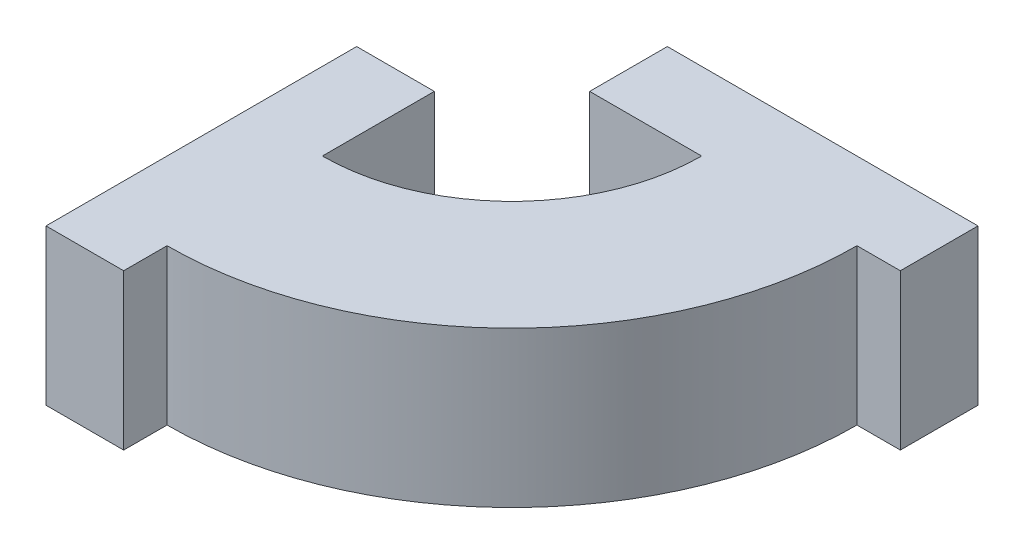
ISO-10303-21;
HEADER;
FILE_DESCRIPTION(('STEP AP214'),'2;1');
FILE_NAME('part.step','',(''),(''),'','','');
FILE_SCHEMA(('AUTOMOTIVE_DESIGN { 1 0 10303 214 1 1 1 1 }'));
ENDSEC;
DATA;
#1=APPLICATION_CONTEXT('core data for automotive mechanical design processes');
#2=APPLICATION_PROTOCOL_DEFINITION('international standard','automotive_design',2000,#1);
#3=PRODUCT_CONTEXT('',#1,'mechanical');
#4=PRODUCT('Part','Part','',(#3));
#5=PRODUCT_RELATED_PRODUCT_CATEGORY('part','',(#4));
#6=PRODUCT_DEFINITION_FORMATION('','',#4);
#7=PRODUCT_DEFINITION_CONTEXT('part definition',#1,'design');
#8=PRODUCT_DEFINITION('design','',#6,#7);
#9=PRODUCT_DEFINITION_SHAPE('','',#8);
#10=(LENGTH_UNIT() NAMED_UNIT(*) SI_UNIT(.MILLI.,.METRE.));
#11=(NAMED_UNIT(*) PLANE_ANGLE_UNIT() SI_UNIT($,.RADIAN.));
#12=(NAMED_UNIT(*) SI_UNIT($,.STERADIAN.) SOLID_ANGLE_UNIT());
#13=UNCERTAINTY_MEASURE_WITH_UNIT(LENGTH_MEASURE(1.E-05),#10,'distance_accuracy_value','');
#14=(GEOMETRIC_REPRESENTATION_CONTEXT(3) GLOBAL_UNCERTAINTY_ASSIGNED_CONTEXT((#13)) GLOBAL_UNIT_ASSIGNED_CONTEXT((#10,
#11,#12)) REPRESENTATION_CONTEXT('',''));
#15=CARTESIAN_POINT('',(0.,0.,0.));
#16=DIRECTION('',(0.,0.,1.));
#17=DIRECTION('',(1.,0.,0.));
#18=AXIS2_PLACEMENT_3D('',#15,#16,#17);
#19=CARTESIAN_POINT('',(1.,2.,0.));
#20=DIRECTION('',(1.,0.,0.));
#21=DIRECTION('',(0.,0.,-1.));
#22=AXIS2_PLACEMENT_3D('',#19,#20,#21);
#23=PLANE('',#22);
#24=DIRECTION('',(0.,0.,1.));
#25=VECTOR('',#24,1.);
#26=CARTESIAN_POINT('',(1.,0.,0.));
#27=LINE('',#26,#25);
#28=CARTESIAN_POINT('',(0.999999999999993,0.,2.));
#29=VERTEX_POINT('',#28);
#30=CARTESIAN_POINT('',(0.999999999999988,0.,3.44167053321325));
#31=VERTEX_POINT('',#30);
#32=EDGE_CURVE('E249',#29,#31,#27,.T.);
#33=ORIENTED_EDGE('',*,*,#32,.F.);
#34=DIRECTION('',(0.,-1.,0.));
#35=VECTOR('',#34,1.);
#36=CARTESIAN_POINT('',(0.999999999999993,2.,2.));
#37=LINE('',#36,#35);
#38=CARTESIAN_POINT('',(0.999999999999993,2.,2.));
#39=VERTEX_POINT('',#38);
#40=EDGE_CURVE('E11',#39,#29,#37,.T.);
#41=ORIENTED_EDGE('',*,*,#40,.F.);
#42=DIRECTION('',(0.,0.,1.));
#43=VECTOR('',#42,1.);
#44=CARTESIAN_POINT('',(1.,2.,0.));
#45=LINE('',#44,#43);
#46=CARTESIAN_POINT('',(0.999999999999988,2.,3.44167053321325));
#47=VERTEX_POINT('',#46);
#48=EDGE_CURVE('E181',#39,#47,#45,.T.);
#49=ORIENTED_EDGE('',*,*,#48,.T.);
#50=DIRECTION('',(0.,-1.,0.));
#51=VECTOR('',#50,1.);
#52=CARTESIAN_POINT('',(0.999999999999988,2.,3.44167053321325));
#53=LINE('',#52,#51);
#54=EDGE_CURVE('E59',#47,#31,#53,.T.);
#55=ORIENTED_EDGE('',*,*,#54,.T.);
#56=EDGE_LOOP('',(#33,#41,#49,#55));
#57=FACE_BOUND('',#56,.T.);
#58=ADVANCED_FACE('F41',(#57),#23,.T.);
#59=CARTESIAN_POINT('',(0.,2.,2.));
#60=DIRECTION('',(0.,0.,-1.));
#61=DIRECTION('',(-1.,0.,0.));
#62=AXIS2_PLACEMENT_3D('',#59,#60,#61);
#63=PLANE('',#62);
#64=DIRECTION('',(1.,0.,0.));
#65=VECTOR('',#64,1.);
#66=CARTESIAN_POINT('',(0.,0.,2.));
#67=LINE('',#66,#65);
#68=CARTESIAN_POINT('',(0.,0.,2.));
#69=VERTEX_POINT('',#68);
#70=EDGE_CURVE('E242',#69,#29,#67,.T.);
#71=ORIENTED_EDGE('',*,*,#70,.F.);
#72=DIRECTION('',(0.,-1.,0.));
#73=VECTOR('',#72,1.);
#74=CARTESIAN_POINT('',(0.,2.,2.));
#75=LINE('',#74,#73);
#76=CARTESIAN_POINT('',(0.,2.,2.));
#77=VERTEX_POINT('',#76);
#78=EDGE_CURVE('E51',#77,#69,#75,.T.);
#79=ORIENTED_EDGE('',*,*,#78,.F.);
#80=DIRECTION('',(1.,0.,0.));
#81=VECTOR('',#80,1.);
#82=CARTESIAN_POINT('',(0.,2.,2.));
#83=LINE('',#82,#81);
#84=EDGE_CURVE('E188',#77,#39,#83,.T.);
#85=ORIENTED_EDGE('',*,*,#84,.T.);
#86=ORIENTED_EDGE('',*,*,#40,.T.);
#87=EDGE_LOOP('',(#71,#79,#85,#86));
#88=FACE_BOUND('',#87,.T.);
#89=ADVANCED_FACE('F43',(#88),#63,.T.);
#90=CARTESIAN_POINT('',(0.,2.,0.));
#91=DIRECTION('',(1.,0.,0.));
#92=DIRECTION('',(0.,0.,-1.));
#93=AXIS2_PLACEMENT_3D('',#90,#91,#92);
#94=PLANE('',#93);
#95=DIRECTION('',(0.,0.,1.));
#96=VECTOR('',#95,1.);
#97=CARTESIAN_POINT('',(0.,0.,0.));
#98=LINE('',#97,#96);
#99=CARTESIAN_POINT('',(0.,0.,6.));
#100=VERTEX_POINT('',#99);
#101=EDGE_CURVE('E235',#69,#100,#98,.T.);
#102=ORIENTED_EDGE('',*,*,#101,.T.);
#103=DIRECTION('',(0.,-1.,0.));
#104=VECTOR('',#103,1.);
#105=CARTESIAN_POINT('',(0.,2.,6.));
#106=LINE('',#105,#104);
#107=CARTESIAN_POINT('',(0.,2.,6.));
#108=VERTEX_POINT('',#107);
#109=EDGE_CURVE('E226',#108,#100,#106,.T.);
#110=ORIENTED_EDGE('',*,*,#109,.F.);
#111=DIRECTION('',(0.,0.,1.));
#112=VECTOR('',#111,1.);
#113=CARTESIAN_POINT('',(0.,2.,0.));
#114=LINE('',#113,#112);
#115=EDGE_CURVE('E185',#77,#108,#114,.T.);
#116=ORIENTED_EDGE('',*,*,#115,.F.);
#117=ORIENTED_EDGE('',*,*,#78,.T.);
#118=EDGE_LOOP('',(#102,#110,#116,#117));
#119=FACE_BOUND('',#118,.T.);
#120=ADVANCED_FACE('F233',(#119),#94,.F.);
#121=CARTESIAN_POINT('',(0.,2.,6.));
#122=DIRECTION('',(0.,0.,-1.));
#123=DIRECTION('',(-1.,0.,0.));
#124=AXIS2_PLACEMENT_3D('',#121,#122,#123);
#125=PLANE('',#124);
#126=DIRECTION('',(1.,0.,0.));
#127=VECTOR('',#126,1.);
#128=CARTESIAN_POINT('',(0.,0.,6.));
#129=LINE('',#128,#127);
#130=CARTESIAN_POINT('',(0.999999999999979,0.,6.));
#131=VERTEX_POINT('',#130);
#132=EDGE_CURVE('E245',#100,#131,#129,.T.);
#133=ORIENTED_EDGE('',*,*,#132,.T.);
#134=DIRECTION('',(0.,-1.,0.));
#135=VECTOR('',#134,1.);
#136=CARTESIAN_POINT('',(0.999999999999979,2.,6.));
#137=LINE('',#136,#135);
#138=CARTESIAN_POINT('',(0.999999999999979,2.,6.));
#139=VERTEX_POINT('',#138);
#140=EDGE_CURVE('E223',#139,#131,#137,.T.);
#141=ORIENTED_EDGE('',*,*,#140,.F.);
#142=DIRECTION('',(1.,0.,0.));
#143=VECTOR('',#142,1.);
#144=CARTESIAN_POINT('',(0.,2.,6.));
#145=LINE('',#144,#143);
#146=EDGE_CURVE('E179',#108,#139,#145,.T.);
#147=ORIENTED_EDGE('',*,*,#146,.F.);
#148=ORIENTED_EDGE('',*,*,#109,.T.);
#149=EDGE_LOOP('',(#133,#141,#147,#148));
#150=FACE_BOUND('',#149,.T.);
#151=ADVANCED_FACE('F287',(#150),#125,.F.);
#152=CARTESIAN_POINT('',(0.999999999999981,0.,5.44167053321325));
#153=VERTEX_POINT('',#152);
#154=EDGE_CURVE('E253',#153,#131,#27,.T.);
#155=ORIENTED_EDGE('',*,*,#154,.F.);
#156=DIRECTION('',(0.,-1.,0.));
#157=VECTOR('',#156,1.);
#158=CARTESIAN_POINT('',(0.999999999999981,2.,5.44167053321325));
#159=LINE('',#158,#157);
#160=CARTESIAN_POINT('',(0.999999999999981,2.,5.44167053321325));
#161=VERTEX_POINT('',#160);
#162=EDGE_CURVE('E220',#161,#153,#159,.T.);
#163=ORIENTED_EDGE('',*,*,#162,.F.);
#164=EDGE_CURVE('E173',#161,#139,#45,.T.);
#165=ORIENTED_EDGE('',*,*,#164,.T.);
#166=ORIENTED_EDGE('',*,*,#140,.T.);
#167=EDGE_LOOP('',(#155,#163,#165,#166));
#168=FACE_BOUND('',#167,.T.);
#169=ADVANCED_FACE('F282',(#168),#23,.T.);
#170=CARTESIAN_POINT('',(0.999999999999994,2.,1.));
#171=DIRECTION('',(0.,-1.,0.));
#172=DIRECTION('',(0.,0.,-1.));
#173=AXIS2_PLACEMENT_3D('',#170,#171,#172);
#174=CYLINDRICAL_SURFACE('',#173,4.44167053321325);
#175=CARTESIAN_POINT('',(0.999999999999994,0.,1.));
#176=DIRECTION('',(0.,1.,0.));
#177=DIRECTION('',(0.,0.,1.));
#178=AXIS2_PLACEMENT_3D('',#175,#176,#177);
#179=CIRCLE('',#178,4.44167053321325);
#180=CARTESIAN_POINT('',(5.44167053321324,0.,1.));
#181=VERTEX_POINT('',#180);
#182=EDGE_CURVE('E257',#153,#181,#179,.T.);
#183=ORIENTED_EDGE('',*,*,#182,.T.);
#184=DIRECTION('',(0.,-1.,0.));
#185=VECTOR('',#184,1.);
#186=CARTESIAN_POINT('',(5.44167053321324,2.,1.));
#187=LINE('',#186,#185);
#188=CARTESIAN_POINT('',(5.44167053321324,2.,1.));
#189=VERTEX_POINT('',#188);
#190=EDGE_CURVE('E216',#189,#181,#187,.T.);
#191=ORIENTED_EDGE('',*,*,#190,.F.);
#192=CARTESIAN_POINT('',(0.999999999999994,2.,1.));
#193=DIRECTION('',(0.,1.,0.));
#194=DIRECTION('',(0.,0.,1.));
#195=AXIS2_PLACEMENT_3D('',#192,#193,#194);
#196=CIRCLE('',#195,4.44167053321325);
#197=EDGE_CURVE('E167',#161,#189,#196,.T.);
#198=ORIENTED_EDGE('',*,*,#197,.F.);
#199=ORIENTED_EDGE('',*,*,#162,.T.);
#200=EDGE_LOOP('',(#183,#191,#198,#199));
#201=FACE_BOUND('',#200,.T.);
#202=ADVANCED_FACE('F306',(#201),#174,.T.);
#203=CARTESIAN_POINT('',(0.,2.,1.));
#204=DIRECTION('',(0.,0.,-1.));
#205=DIRECTION('',(-1.,0.,0.));
#206=AXIS2_PLACEMENT_3D('',#203,#204,#205);
#207=PLANE('',#206);
#208=DIRECTION('',(1.,0.,0.));
#209=VECTOR('',#208,1.);
#210=CARTESIAN_POINT('',(0.,0.,1.));
#211=LINE('',#210,#209);
#212=CARTESIAN_POINT('',(6.,0.,1.));
#213=VERTEX_POINT('',#212);
#214=EDGE_CURVE('E200',#181,#213,#211,.T.);
#215=ORIENTED_EDGE('',*,*,#214,.T.);
#216=DIRECTION('',(0.,-1.,0.));
#217=VECTOR('',#216,1.);
#218=CARTESIAN_POINT('',(6.,2.,1.));
#219=LINE('',#218,#217);
#220=CARTESIAN_POINT('',(6.,2.,1.));
#221=VERTEX_POINT('',#220);
#222=EDGE_CURVE('E213',#221,#213,#219,.T.);
#223=ORIENTED_EDGE('',*,*,#222,.F.);
#224=DIRECTION('',(1.,0.,0.));
#225=VECTOR('',#224,1.);
#226=CARTESIAN_POINT('',(0.,2.,1.));
#227=LINE('',#226,#225);
#228=EDGE_CURVE('E160',#189,#221,#227,.T.);
#229=ORIENTED_EDGE('',*,*,#228,.F.);
#230=ORIENTED_EDGE('',*,*,#190,.T.);
#231=EDGE_LOOP('',(#215,#223,#229,#230));
#232=FACE_BOUND('',#231,.T.);
#233=ADVANCED_FACE('F277',(#232),#207,.F.);
#234=CARTESIAN_POINT('',(6.,2.,0.));
#235=DIRECTION('',(1.,0.,0.));
#236=DIRECTION('',(0.,0.,-1.));
#237=AXIS2_PLACEMENT_3D('',#234,#235,#236);
#238=PLANE('',#237);
#239=DIRECTION('',(0.,0.,1.));
#240=VECTOR('',#239,1.);
#241=CARTESIAN_POINT('',(6.,0.,0.));
#242=LINE('',#241,#240);
#243=CARTESIAN_POINT('',(6.,0.,0.));
#244=VERTEX_POINT('',#243);
#245=EDGE_CURVE('E262',#244,#213,#242,.T.);
#246=ORIENTED_EDGE('',*,*,#245,.F.);
#247=DIRECTION('',(0.,-1.,0.));
#248=VECTOR('',#247,1.);
#249=CARTESIAN_POINT('',(6.,2.,0.));
#250=LINE('',#249,#248);
#251=CARTESIAN_POINT('',(6.,2.,0.));
#252=VERTEX_POINT('',#251);
#253=EDGE_CURVE('E210',#252,#244,#250,.T.);
#254=ORIENTED_EDGE('',*,*,#253,.F.);
#255=DIRECTION('',(0.,0.,1.));
#256=VECTOR('',#255,1.);
#257=CARTESIAN_POINT('',(6.,2.,0.));
#258=LINE('',#257,#256);
#259=EDGE_CURVE('E166',#252,#221,#258,.T.);
#260=ORIENTED_EDGE('',*,*,#259,.T.);
#261=ORIENTED_EDGE('',*,*,#222,.T.);
#262=EDGE_LOOP('',(#246,#254,#260,#261));
#263=FACE_BOUND('',#262,.T.);
#264=ADVANCED_FACE('F275',(#263),#238,.T.);
#265=CARTESIAN_POINT('',(0.,2.,0.));
#266=DIRECTION('',(0.,0.,-1.));
#267=DIRECTION('',(-1.,0.,0.));
#268=AXIS2_PLACEMENT_3D('',#265,#266,#267);
#269=PLANE('',#268);
#270=DIRECTION('',(1.,0.,0.));
#271=VECTOR('',#270,1.);
#272=CARTESIAN_POINT('',(0.,0.,0.));
#273=LINE('',#272,#271);
#274=CARTESIAN_POINT('',(2.,0.,0.));
#275=VERTEX_POINT('',#274);
#276=EDGE_CURVE('E265',#275,#244,#273,.T.);
#277=ORIENTED_EDGE('',*,*,#276,.F.);
#278=DIRECTION('',(0.,-1.,0.));
#279=VECTOR('',#278,1.);
#280=CARTESIAN_POINT('',(2.,2.,0.));
#281=LINE('',#280,#279);
#282=CARTESIAN_POINT('',(2.,2.,0.));
#283=VERTEX_POINT('',#282);
#284=EDGE_CURVE('E154',#283,#275,#281,.T.);
#285=ORIENTED_EDGE('',*,*,#284,.F.);
#286=DIRECTION('',(1.,0.,0.));
#287=VECTOR('',#286,1.);
#288=CARTESIAN_POINT('',(0.,2.,0.));
#289=LINE('',#288,#287);
#290=EDGE_CURVE('E142',#283,#252,#289,.T.);
#291=ORIENTED_EDGE('',*,*,#290,.T.);
#292=ORIENTED_EDGE('',*,*,#253,.T.);
#293=EDGE_LOOP('',(#277,#285,#291,#292));
#294=FACE_BOUND('',#293,.T.);
#295=ADVANCED_FACE('F273',(#294),#269,.T.);
#296=CARTESIAN_POINT('',(2.,2.,0.));
#297=DIRECTION('',(1.,0.,0.));
#298=DIRECTION('',(0.,0.,-1.));
#299=AXIS2_PLACEMENT_3D('',#296,#297,#298);
#300=PLANE('',#299);
#301=DIRECTION('',(0.,0.,1.));
#302=VECTOR('',#301,1.);
#303=CARTESIAN_POINT('',(2.,0.,0.));
#304=LINE('',#303,#302);
#305=CARTESIAN_POINT('',(2.,0.,1.));
#306=VERTEX_POINT('',#305);
#307=EDGE_CURVE('E150',#275,#306,#304,.T.);
#308=ORIENTED_EDGE('',*,*,#307,.T.);
#309=DIRECTION('',(0.,-1.,0.));
#310=VECTOR('',#309,1.);
#311=CARTESIAN_POINT('',(2.,2.,1.));
#312=LINE('',#311,#310);
#313=CARTESIAN_POINT('',(2.,2.,1.));
#314=VERTEX_POINT('',#313);
#315=EDGE_CURVE('E147',#314,#306,#312,.T.);
#316=ORIENTED_EDGE('',*,*,#315,.F.);
#317=DIRECTION('',(0.,0.,1.));
#318=VECTOR('',#317,1.);
#319=CARTESIAN_POINT('',(2.,2.,0.));
#320=LINE('',#319,#318);
#321=EDGE_CURVE('E134',#283,#314,#320,.T.);
#322=ORIENTED_EDGE('',*,*,#321,.F.);
#323=ORIENTED_EDGE('',*,*,#284,.T.);
#324=EDGE_LOOP('',(#308,#316,#322,#323));
#325=FACE_BOUND('',#324,.T.);
#326=ADVANCED_FACE('F148',(#325),#300,.F.);
#327=CARTESIAN_POINT('',(3.44167053321324,0.,1.));
#328=VERTEX_POINT('',#327);
#329=EDGE_CURVE('E195',#306,#328,#211,.T.);
#330=ORIENTED_EDGE('',*,*,#329,.T.);
#331=DIRECTION('',(0.,-1.,0.));
#332=VECTOR('',#331,1.);
#333=CARTESIAN_POINT('',(3.44167053321324,2.,1.));
#334=LINE('',#333,#332);
#335=CARTESIAN_POINT('',(3.44167053321324,2.,1.));
#336=VERTEX_POINT('',#335);
#337=EDGE_CURVE('E97',#336,#328,#334,.T.);
#338=ORIENTED_EDGE('',*,*,#337,.F.);
#339=EDGE_CURVE('E139',#314,#336,#227,.T.);
#340=ORIENTED_EDGE('',*,*,#339,.F.);
#341=ORIENTED_EDGE('',*,*,#315,.T.);
#342=EDGE_LOOP('',(#330,#338,#340,#341));
#343=FACE_BOUND('',#342,.T.);
#344=ADVANCED_FACE('F156',(#343),#207,.F.);
#345=CARTESIAN_POINT('',(0.999999999999994,2.,1.));
#346=DIRECTION('',(0.,-1.,0.));
#347=DIRECTION('',(0.,0.,-1.));
#348=AXIS2_PLACEMENT_3D('',#345,#346,#347);
#349=CYLINDRICAL_SURFACE('',#348,2.44167053321325);
#350=CARTESIAN_POINT('',(0.999999999999994,0.,1.));
#351=DIRECTION('',(0.,1.,0.));
#352=DIRECTION('',(0.,0.,1.));
#353=AXIS2_PLACEMENT_3D('',#350,#351,#352);
#354=CIRCLE('',#353,2.44167053321325);
#355=EDGE_CURVE('E192',#31,#328,#354,.T.);
#356=ORIENTED_EDGE('',*,*,#355,.F.);
#357=ORIENTED_EDGE('',*,*,#54,.F.);
#358=CARTESIAN_POINT('',(0.999999999999994,2.,1.));
#359=DIRECTION('',(0.,1.,0.));
#360=DIRECTION('',(0.,0.,1.));
#361=AXIS2_PLACEMENT_3D('',#358,#359,#360);
#362=CIRCLE('',#361,2.44167053321325);
#363=EDGE_CURVE('E158',#47,#336,#362,.T.);
#364=ORIENTED_EDGE('',*,*,#363,.T.);
#365=ORIENTED_EDGE('',*,*,#337,.T.);
#366=EDGE_LOOP('',(#356,#357,#364,#365));
#367=FACE_BOUND('',#366,.T.);
#368=ADVANCED_FACE('F288',(#367),#349,.F.);
#369=CARTESIAN_POINT('',(0.,2.,0.));
#370=DIRECTION('',(0.,1.,0.));
#371=DIRECTION('',(0.,0.,1.));
#372=AXIS2_PLACEMENT_3D('',#369,#370,#371);
#373=PLANE('',#372);
#374=ORIENTED_EDGE('',*,*,#48,.F.);
#375=ORIENTED_EDGE('',*,*,#84,.F.);
#376=ORIENTED_EDGE('',*,*,#115,.T.);
#377=ORIENTED_EDGE('',*,*,#146,.T.);
#378=ORIENTED_EDGE('',*,*,#164,.F.);
#379=ORIENTED_EDGE('',*,*,#197,.T.);
#380=ORIENTED_EDGE('',*,*,#228,.T.);
#381=ORIENTED_EDGE('',*,*,#259,.F.);
#382=ORIENTED_EDGE('',*,*,#290,.F.);
#383=ORIENTED_EDGE('',*,*,#321,.T.);
#384=ORIENTED_EDGE('',*,*,#339,.T.);
#385=ORIENTED_EDGE('',*,*,#363,.F.);
#386=EDGE_LOOP('',(#374,#375,#376,#377,#378,#379,#380,#381,#382,#383,#384,#385));
#387=FACE_BOUND('',#386,.T.);
#388=ADVANCED_FACE('F136',(#387),#373,.T.);
#389=CARTESIAN_POINT('',(0.,0.,0.));
#390=DIRECTION('',(0.,1.,0.));
#391=DIRECTION('',(0.,0.,1.));
#392=AXIS2_PLACEMENT_3D('',#389,#390,#391);
#393=PLANE('',#392);
#394=ORIENTED_EDGE('',*,*,#32,.T.);
#395=ORIENTED_EDGE('',*,*,#355,.T.);
#396=ORIENTED_EDGE('',*,*,#329,.F.);
#397=ORIENTED_EDGE('',*,*,#307,.F.);
#398=ORIENTED_EDGE('',*,*,#276,.T.);
#399=ORIENTED_EDGE('',*,*,#245,.T.);
#400=ORIENTED_EDGE('',*,*,#214,.F.);
#401=ORIENTED_EDGE('',*,*,#182,.F.);
#402=ORIENTED_EDGE('',*,*,#154,.T.);
#403=ORIENTED_EDGE('',*,*,#132,.F.);
#404=ORIENTED_EDGE('',*,*,#101,.F.);
#405=ORIENTED_EDGE('',*,*,#70,.T.);
#406=EDGE_LOOP('',(#394,#395,#396,#397,#398,#399,#400,#401,#402,#403,#404,#405));
#407=FACE_BOUND('',#406,.T.);
#408=ADVANCED_FACE('F241',(#407),#393,.F.);
#409=CLOSED_SHELL('',(#58,#89,#120,#151,#169,#202,#233,#264,#295,#326,#344,#368,#388,#408));
#410=MANIFOLD_SOLID_BREP('B2',#409);
#411=ADVANCED_BREP_SHAPE_REPRESENTATION('',(#18,#410),#14);
#412=SHAPE_DEFINITION_REPRESENTATION(#9,#411);
ENDSEC;
END-ISO-10303-21;
